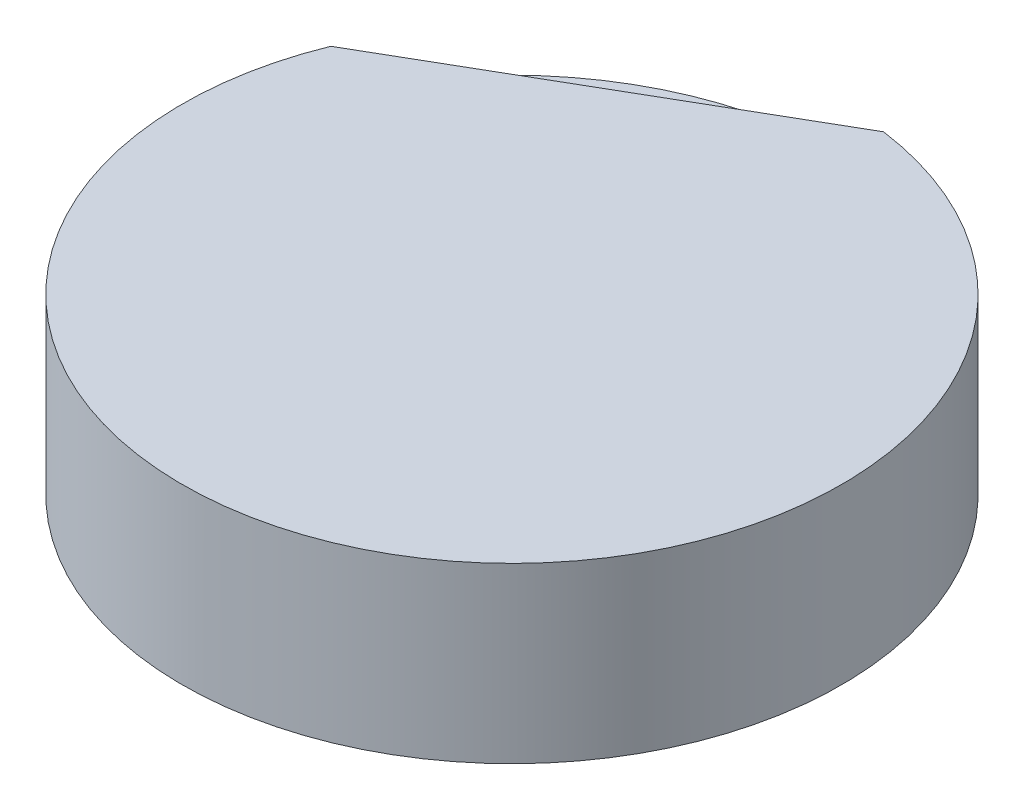
ISO-10303-21;
HEADER;
FILE_DESCRIPTION(('STEP AP214'),'2;1');
FILE_NAME('part.step','',(''),(''),'','','');
FILE_SCHEMA(('AUTOMOTIVE_DESIGN { 1 0 10303 214 1 1 1 1 }'));
ENDSEC;
DATA;
#1=APPLICATION_CONTEXT('core data for automotive mechanical design processes');
#2=APPLICATION_PROTOCOL_DEFINITION('international standard','automotive_design',2000,#1);
#3=PRODUCT_CONTEXT('',#1,'mechanical');
#4=PRODUCT('Part','Part','',(#3));
#5=PRODUCT_RELATED_PRODUCT_CATEGORY('part','',(#4));
#6=PRODUCT_DEFINITION_FORMATION('','',#4);
#7=PRODUCT_DEFINITION_CONTEXT('part definition',#1,'design');
#8=PRODUCT_DEFINITION('design','',#6,#7);
#9=PRODUCT_DEFINITION_SHAPE('','',#8);
#10=(LENGTH_UNIT() NAMED_UNIT(*) SI_UNIT(.MILLI.,.METRE.));
#11=(NAMED_UNIT(*) PLANE_ANGLE_UNIT() SI_UNIT($,.RADIAN.));
#12=(NAMED_UNIT(*) SI_UNIT($,.STERADIAN.) SOLID_ANGLE_UNIT());
#13=UNCERTAINTY_MEASURE_WITH_UNIT(LENGTH_MEASURE(1.E-05),#10,'distance_accuracy_value','');
#14=(GEOMETRIC_REPRESENTATION_CONTEXT(3) GLOBAL_UNCERTAINTY_ASSIGNED_CONTEXT((#13)) GLOBAL_UNIT_ASSIGNED_CONTEXT((#10,
#11,#12)) REPRESENTATION_CONTEXT('',''));
#15=CARTESIAN_POINT('',(0.,0.,0.));
#16=DIRECTION('',(0.,0.,1.));
#17=DIRECTION('',(1.,0.,0.));
#18=AXIS2_PLACEMENT_3D('',#15,#16,#17);
#19=CARTESIAN_POINT('',(-71.2916512459885,-69.5,-25.9807621135332));
#20=DIRECTION('',(0.,1.,0.));
#21=DIRECTION('',(0.,0.,1.));
#22=AXIS2_PLACEMENT_3D('',#19,#20,#21);
#23=CYLINDRICAL_SURFACE('',#22,3.8);
#24=CARTESIAN_POINT('',(-71.2916512459885,-69.,-25.9807621135332));
#25=DIRECTION('',(0.,-1.,0.));
#26=DIRECTION('',(0.,0.,-1.));
#27=AXIS2_PLACEMENT_3D('',#24,#25,#26);
#28=CIRCLE('',#27,3.8);
#29=CARTESIAN_POINT('',(-70.7717502583161,-69.,-29.7450287038555));
#30=VERTEX_POINT('',#29);
#31=CARTESIAN_POINT('',(-74.811552233661,-69.,-27.4126479459174));
#32=VERTEX_POINT('',#31);
#33=EDGE_CURVE('E82',#30,#32,#28,.T.);
#34=ORIENTED_EDGE('',*,*,#33,.T.);
#35=DIRECTION('',(0.,1.,0.));
#36=VECTOR('',#35,1.);
#37=CARTESIAN_POINT('',(-74.811552233661,-69.5,-27.4126479459174));
#38=LINE('',#37,#36);
#39=CARTESIAN_POINT('',(-74.811552233661,-69.5,-27.4126479459174));
#40=VERTEX_POINT('',#39);
#41=EDGE_CURVE('E11',#40,#32,#38,.T.);
#42=ORIENTED_EDGE('',*,*,#41,.F.);
#43=CARTESIAN_POINT('',(-71.2916512459885,-69.5,-25.9807621135332));
#44=DIRECTION('',(0.,-1.,0.));
#45=DIRECTION('',(0.,0.,-1.));
#46=AXIS2_PLACEMENT_3D('',#43,#44,#45);
#47=CIRCLE('',#46,3.8);
#48=CARTESIAN_POINT('',(-70.7717502583161,-69.5,-29.7450287038555));
#49=VERTEX_POINT('',#48);
#50=EDGE_CURVE('E73',#40,#49,#47,.T.);
#51=ORIENTED_EDGE('',*,*,#50,.T.);
#52=DIRECTION('',(0.,1.,0.));
#53=VECTOR('',#52,1.);
#54=CARTESIAN_POINT('',(-70.7717502583161,-69.5,-29.7450287038555));
#55=LINE('',#54,#53);
#56=EDGE_CURVE('E49',#49,#30,#55,.T.);
#57=ORIENTED_EDGE('',*,*,#56,.T.);
#58=EDGE_LOOP('',(#34,#42,#51,#57));
#59=FACE_BOUND('',#58,.T.);
#60=CARTESIAN_POINT('',(-71.2916512459885,-71.,-25.9807621135332));
#61=DIRECTION('',(0.,-1.,0.));
#62=DIRECTION('',(0.,0.,-1.));
#63=AXIS2_PLACEMENT_3D('',#60,#61,#62);
#64=CIRCLE('',#63,3.8);
#65=CARTESIAN_POINT('',(-71.2916512459885,-71.,-29.7807621135332));
#66=VERTEX_POINT('',#65);
#67=EDGE_CURVE('E79',#66,#66,#64,.T.);
#68=ORIENTED_EDGE('',*,*,#67,.F.);
#69=EDGE_LOOP('',(#68));
#70=FACE_BOUND('',#69,.T.);
#71=ADVANCED_FACE('F41',(#59,#70),#23,.T.);
#72=CARTESIAN_POINT('',(-74.811552233661,-69.5,-27.4126479459174));
#73=DIRECTION('',(0.499999999999999,0.,0.86602540378444));
#74=DIRECTION('',(0.86602540378444,0.,-0.499999999999999));
#75=AXIS2_PLACEMENT_3D('',#72,#73,#74);
#76=PLANE('',#75);
#77=DIRECTION('',(0.86602540378444,0.,-0.499999999999999));
#78=VECTOR('',#77,1.);
#79=CARTESIAN_POINT('',(-74.811552233661,-69.,-27.4126479459174));
#80=LINE('',#79,#78);
#81=EDGE_CURVE('E65',#32,#30,#80,.T.);
#82=ORIENTED_EDGE('',*,*,#81,.T.);
#83=ORIENTED_EDGE('',*,*,#56,.F.);
#84=DIRECTION('',(0.86602540378444,0.,-0.499999999999999));
#85=VECTOR('',#84,1.);
#86=CARTESIAN_POINT('',(-74.811552233661,-69.5,-27.4126479459174));
#87=LINE('',#86,#85);
#88=EDGE_CURVE('E57',#40,#49,#87,.T.);
#89=ORIENTED_EDGE('',*,*,#88,.F.);
#90=ORIENTED_EDGE('',*,*,#41,.T.);
#91=EDGE_LOOP('',(#82,#83,#89,#90));
#92=FACE_BOUND('',#91,.T.);
#93=ADVANCED_FACE('F70',(#92),#76,.F.);
#94=CARTESIAN_POINT('',(-71.2916512459885,-69.,-25.9807621135332));
#95=DIRECTION('',(0.,-1.,0.));
#96=DIRECTION('',(0.,0.,-1.));
#97=AXIS2_PLACEMENT_3D('',#94,#95,#96);
#98=PLANE('',#97);
#99=ORIENTED_EDGE('',*,*,#33,.F.);
#100=ORIENTED_EDGE('',*,*,#81,.F.);
#101=EDGE_LOOP('',(#99,#100));
#102=FACE_BOUND('',#101,.T.);
#103=ADVANCED_FACE('F88',(#102),#98,.F.);
#104=CARTESIAN_POINT('',(-71.2916512459885,-69.5,-25.9807621135332));
#105=DIRECTION('',(0.,-1.,0.));
#106=DIRECTION('',(0.,0.,-1.));
#107=AXIS2_PLACEMENT_3D('',#104,#105,#106);
#108=PLANE('',#107);
#109=ORIENTED_EDGE('',*,*,#50,.F.);
#110=ORIENTED_EDGE('',*,*,#88,.T.);
#111=EDGE_LOOP('',(#109,#110));
#112=FACE_BOUND('',#111,.T.);
#113=ADVANCED_FACE('F74',(#112),#108,.F.);
#114=CARTESIAN_POINT('',(-71.2916512459885,-71.,-25.9807621135332));
#115=DIRECTION('',(0.,-1.,0.));
#116=DIRECTION('',(0.,0.,-1.));
#117=AXIS2_PLACEMENT_3D('',#114,#115,#116);
#118=PLANE('',#117);
#119=CARTESIAN_POINT('',(-71.2916512459885,-71.,-25.9807621135332));
#120=DIRECTION('',(0.,-1.,0.));
#121=DIRECTION('',(0.,0.,-1.));
#122=AXIS2_PLACEMENT_3D('',#119,#120,#121);
#123=CIRCLE('',#122,2.36854385646542);
#124=CARTESIAN_POINT('',(-71.2916512459885,-71.,-28.3493059699986));
#125=VERTEX_POINT('',#124);
#126=EDGE_CURVE('E42',#125,#125,#123,.T.);
#127=ORIENTED_EDGE('',*,*,#126,.F.);
#128=EDGE_LOOP('',(#127));
#129=FACE_BOUND('',#128,.T.);
#130=ORIENTED_EDGE('',*,*,#67,.T.);
#131=EDGE_LOOP('',(#130));
#132=FACE_BOUND('',#131,.T.);
#133=ADVANCED_FACE('F91',(#129,#132),#118,.T.);
#134=CARTESIAN_POINT('',(-71.2916512459885,-73.,-25.9807621135332));
#135=DIRECTION('',(0.,0.,-1.));
#136=DIRECTION('',(-1.,0.,0.));
#137=AXIS2_PLACEMENT_3D('',#134,#135,#136);
#138=SPHERICAL_SURFACE('',#137,3.1);
#139=CARTESIAN_POINT('',(-71.2916512459885,-73.,-25.9807621135332));
#140=DIRECTION('',(0.,-1.,0.));
#141=DIRECTION('',(0.,0.,-1.));
#142=AXIS2_PLACEMENT_3D('',#139,#140,#141);
#143=SPHERICAL_SURFACE('',#142,3.1);
#144=ORIENTED_EDGE('',*,*,#126,.T.);
#145=EDGE_LOOP('',(#144));
#146=FACE_BOUND('',#145,.T.);
#147=ADVANCED_FACE('F113',(#146),#143,.F.);
#148=CLOSED_SHELL('',(#71,#93,#103,#113,#133,#147));
#149=MANIFOLD_SOLID_BREP('B2',#148);
#150=ADVANCED_BREP_SHAPE_REPRESENTATION('',(#18,#149),#14);
#151=SHAPE_DEFINITION_REPRESENTATION(#9,#150);
ENDSEC;
END-ISO-10303-21;
